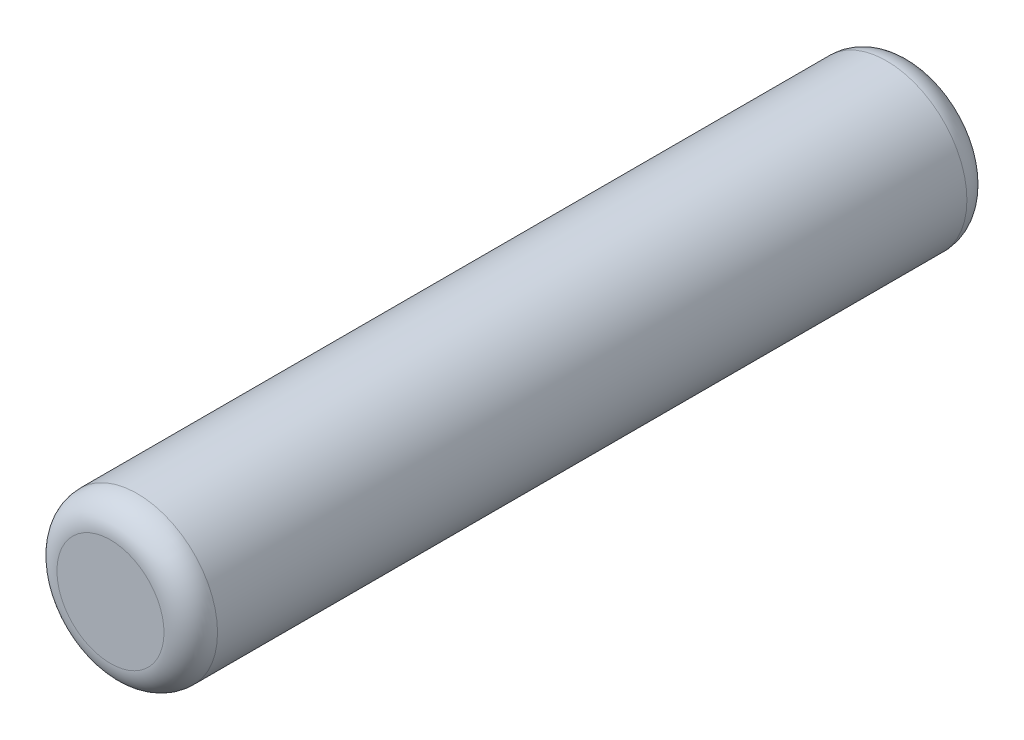
ISO-10303-21;
HEADER;
FILE_DESCRIPTION(('STEP AP214'),'2;1');
FILE_NAME('part.step','',(''),(''),'','','');
FILE_SCHEMA(('AUTOMOTIVE_DESIGN { 1 0 10303 214 1 1 1 1 }'));
ENDSEC;
DATA;
#1=APPLICATION_CONTEXT('core data for automotive mechanical design processes');
#2=APPLICATION_PROTOCOL_DEFINITION('international standard','automotive_design',2000,#1);
#3=PRODUCT_CONTEXT('',#1,'mechanical');
#4=PRODUCT('Part','Part','',(#3));
#5=PRODUCT_RELATED_PRODUCT_CATEGORY('part','',(#4));
#6=PRODUCT_DEFINITION_FORMATION('','',#4);
#7=PRODUCT_DEFINITION_CONTEXT('part definition',#1,'design');
#8=PRODUCT_DEFINITION('design','',#6,#7);
#9=PRODUCT_DEFINITION_SHAPE('','',#8);
#10=(LENGTH_UNIT() NAMED_UNIT(*) SI_UNIT(.MILLI.,.METRE.));
#11=(NAMED_UNIT(*) PLANE_ANGLE_UNIT() SI_UNIT($,.RADIAN.));
#12=(NAMED_UNIT(*) SI_UNIT($,.STERADIAN.) SOLID_ANGLE_UNIT());
#13=UNCERTAINTY_MEASURE_WITH_UNIT(LENGTH_MEASURE(1.E-05),#10,'distance_accuracy_value','');
#14=(GEOMETRIC_REPRESENTATION_CONTEXT(3) GLOBAL_UNCERTAINTY_ASSIGNED_CONTEXT((#13)) GLOBAL_UNIT_ASSIGNED_CONTEXT((#10,
#11,#12)) REPRESENTATION_CONTEXT('',''));
#15=CARTESIAN_POINT('',(0.,0.,0.));
#16=DIRECTION('',(0.,0.,1.));
#17=DIRECTION('',(1.,0.,0.));
#18=AXIS2_PLACEMENT_3D('',#15,#16,#17);
#19=CARTESIAN_POINT('',(0.,0.,3.));
#20=DIRECTION('',(0.,0.,-1.));
#21=DIRECTION('',(-1.,0.,0.));
#22=AXIS2_PLACEMENT_3D('',#19,#20,#21);
#23=CYLINDRICAL_SURFACE('',#22,0.6);
#24=CARTESIAN_POINT('',(0.,0.,-2.8));
#25=DIRECTION('',(0.,0.,1.));
#26=DIRECTION('',(1.,0.,0.));
#27=AXIS2_PLACEMENT_3D('',#24,#25,#26);
#28=CIRCLE('',#27,0.6);
#29=CARTESIAN_POINT('',(0.6,0.,-2.8));
#30=VERTEX_POINT('',#29);
#31=EDGE_CURVE('E55',#30,#30,#28,.T.);
#32=ORIENTED_EDGE('',*,*,#31,.T.);
#33=EDGE_LOOP('',(#32));
#34=FACE_BOUND('',#33,.T.);
#35=CARTESIAN_POINT('',(0.,0.,2.8));
#36=DIRECTION('',(0.,0.,1.));
#37=DIRECTION('',(1.,0.,0.));
#38=AXIS2_PLACEMENT_3D('',#35,#36,#37);
#39=CIRCLE('',#38,0.6);
#40=CARTESIAN_POINT('',(0.6,0.,2.8));
#41=VERTEX_POINT('',#40);
#42=EDGE_CURVE('E60',#41,#41,#39,.F.);
#43=ORIENTED_EDGE('',*,*,#42,.T.);
#44=EDGE_LOOP('',(#43));
#45=FACE_BOUND('',#44,.T.);
#46=ADVANCED_FACE('F42',(#34,#45),#23,.T.);
#47=CARTESIAN_POINT('',(0.,0.,3.));
#48=DIRECTION('',(0.,0.,1.));
#49=DIRECTION('',(1.,0.,0.));
#50=AXIS2_PLACEMENT_3D('',#47,#48,#49);
#51=PLANE('',#50);
#52=CARTESIAN_POINT('',(0.,0.,3.));
#53=DIRECTION('',(0.,0.,1.));
#54=DIRECTION('',(1.,0.,0.));
#55=AXIS2_PLACEMENT_3D('',#52,#53,#54);
#56=CIRCLE('',#55,0.4);
#57=CARTESIAN_POINT('',(0.4,0.,3.));
#58=VERTEX_POINT('',#57);
#59=EDGE_CURVE('E10',#58,#58,#56,.T.);
#60=ORIENTED_EDGE('',*,*,#59,.T.);
#61=EDGE_LOOP('',(#60));
#62=FACE_BOUND('',#61,.T.);
#63=ADVANCED_FACE('F77',(#62),#51,.T.);
#64=CARTESIAN_POINT('',(0.,0.,-3.));
#65=DIRECTION('',(0.,0.,1.));
#66=DIRECTION('',(1.,0.,0.));
#67=AXIS2_PLACEMENT_3D('',#64,#65,#66);
#68=PLANE('',#67);
#69=CARTESIAN_POINT('',(0.,0.,-3.));
#70=DIRECTION('',(0.,0.,1.));
#71=DIRECTION('',(1.,0.,0.));
#72=AXIS2_PLACEMENT_3D('',#69,#70,#71);
#73=CIRCLE('',#72,0.4);
#74=CARTESIAN_POINT('',(0.4,0.,-3.));
#75=VERTEX_POINT('',#74);
#76=EDGE_CURVE('E50',#75,#75,#73,.F.);
#77=ORIENTED_EDGE('',*,*,#76,.T.);
#78=EDGE_LOOP('',(#77));
#79=FACE_BOUND('',#78,.T.);
#80=ADVANCED_FACE('F74',(#79),#68,.F.);
#81=CARTESIAN_POINT('',(0.,0.,-2.8));
#82=DIRECTION('',(0.,0.,1.));
#83=DIRECTION('',(1.,0.,0.));
#84=AXIS2_PLACEMENT_3D('',#81,#82,#83);
#85=TOROIDAL_SURFACE('',#84,0.4,0.2);
#86=ORIENTED_EDGE('',*,*,#76,.F.);
#87=EDGE_LOOP('',(#86));
#88=FACE_BOUND('',#87,.T.);
#89=ORIENTED_EDGE('',*,*,#31,.F.);
#90=EDGE_LOOP('',(#89));
#91=FACE_BOUND('',#90,.T.);
#92=ADVANCED_FACE('F70',(#88,#91),#85,.T.);
#93=CARTESIAN_POINT('',(0.,0.,2.8));
#94=DIRECTION('',(0.,0.,1.));
#95=DIRECTION('',(1.,0.,0.));
#96=AXIS2_PLACEMENT_3D('',#93,#94,#95);
#97=TOROIDAL_SURFACE('',#96,0.4,0.2);
#98=ORIENTED_EDGE('',*,*,#42,.F.);
#99=EDGE_LOOP('',(#98));
#100=FACE_BOUND('',#99,.T.);
#101=ORIENTED_EDGE('',*,*,#59,.F.);
#102=EDGE_LOOP('',(#101));
#103=FACE_BOUND('',#102,.T.);
#104=ADVANCED_FACE('F44',(#100,#103),#97,.T.);
#105=CLOSED_SHELL('',(#46,#63,#80,#92,#104));
#106=MANIFOLD_SOLID_BREP('B2',#105);
#107=ADVANCED_BREP_SHAPE_REPRESENTATION('',(#18,#106),#14);
#108=SHAPE_DEFINITION_REPRESENTATION(#9,#107);
ENDSEC;
END-ISO-10303-21;
